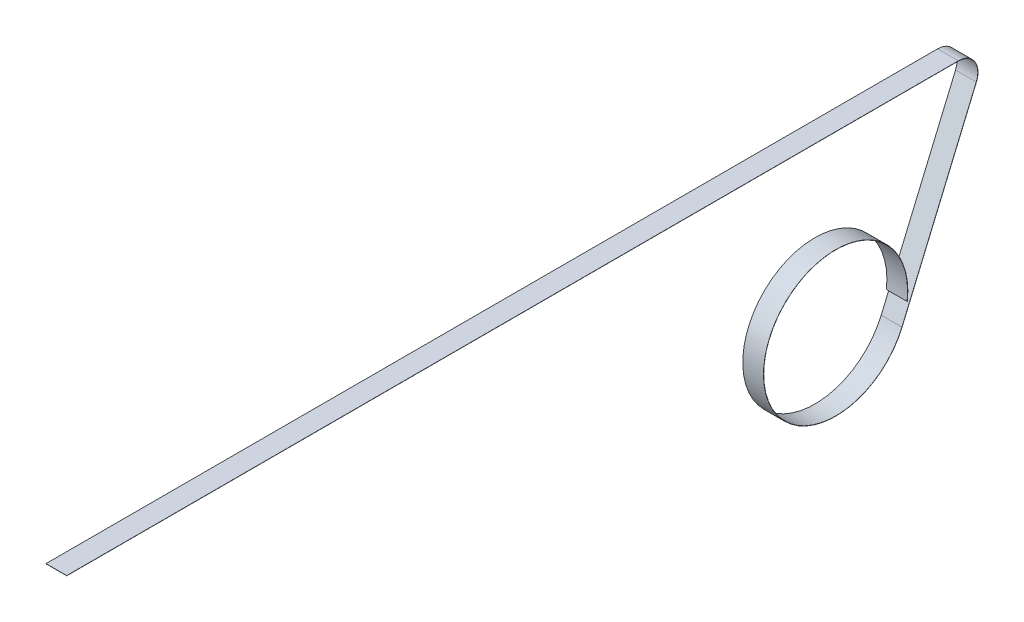
ISO-10303-21;
HEADER;
FILE_DESCRIPTION(('STEP AP214'),'2;1');
FILE_NAME('part.step','',(''),(''),'','','');
FILE_SCHEMA(('AUTOMOTIVE_DESIGN { 1 0 10303 214 1 1 1 1 }'));
ENDSEC;
DATA;
#1=APPLICATION_CONTEXT('core data for automotive mechanical design processes');
#2=APPLICATION_PROTOCOL_DEFINITION('international standard','automotive_design',2000,#1);
#3=PRODUCT_CONTEXT('',#1,'mechanical');
#4=PRODUCT('Part','Part','',(#3));
#5=PRODUCT_RELATED_PRODUCT_CATEGORY('part','',(#4));
#6=PRODUCT_DEFINITION_FORMATION('','',#4);
#7=PRODUCT_DEFINITION_CONTEXT('part definition',#1,'design');
#8=PRODUCT_DEFINITION('design','',#6,#7);
#9=PRODUCT_DEFINITION_SHAPE('','',#8);
#10=(LENGTH_UNIT() NAMED_UNIT(*) SI_UNIT(.MILLI.,.METRE.));
#11=(NAMED_UNIT(*) PLANE_ANGLE_UNIT() SI_UNIT($,.RADIAN.));
#12=(NAMED_UNIT(*) SI_UNIT($,.STERADIAN.) SOLID_ANGLE_UNIT());
#13=UNCERTAINTY_MEASURE_WITH_UNIT(LENGTH_MEASURE(1.E-05),#10,'distance_accuracy_value','');
#14=(GEOMETRIC_REPRESENTATION_CONTEXT(3) GLOBAL_UNCERTAINTY_ASSIGNED_CONTEXT((#13)) GLOBAL_UNIT_ASSIGNED_CONTEXT((#10,
#11,#12)) REPRESENTATION_CONTEXT('',''));
#15=CARTESIAN_POINT('',(0.,0.,0.));
#16=DIRECTION('',(0.,0.,1.));
#17=DIRECTION('',(1.,0.,0.));
#18=AXIS2_PLACEMENT_3D('',#15,#16,#17);
#19=CARTESIAN_POINT('',(0.,0.,1091.946));
#20=DIRECTION('',(-1.,0.,0.));
#21=DIRECTION('',(0.,0.,1.));
#22=AXIS2_PLACEMENT_3D('',#19,#20,#21);
#23=PLANE('',#22);
#24=DIRECTION('',(0.,0.,-1.));
#25=VECTOR('',#24,1.);
#26=CARTESIAN_POINT('',(0.,0.254,1091.946));
#27=LINE('',#26,#25);
#28=CARTESIAN_POINT('',(0.,0.254,1091.946));
#29=VERTEX_POINT('',#28);
#30=CARTESIAN_POINT('',(0.,0.254,0.));
#31=VERTEX_POINT('',#30);
#32=EDGE_CURVE('E36',#29,#31,#27,.T.);
#33=ORIENTED_EDGE('',*,*,#32,.T.);
#34=CARTESIAN_POINT('',(0.,-23.876,0.));
#35=DIRECTION('',(1.,0.,0.));
#36=DIRECTION('',(0.,0.,-1.));
#37=AXIS2_PLACEMENT_3D('',#34,#35,#36);
#38=CIRCLE('',#37,24.13);
#39=CARTESIAN_POINT('',(0.,-33.3037140253817,-22.2120487181084));
#40=VERTEX_POINT('',#39);
#41=EDGE_CURVE('E116',#40,#31,#38,.T.);
#42=ORIENTED_EDGE('',*,*,#41,.F.);
#43=DIRECTION('',(0.,0.920515902118044,-0.390705098441015));
#44=VECTOR('',#43,1.);
#45=CARTESIAN_POINT('',(0.,-33.3037140253817,-22.2120487181084));
#46=LINE('',#45,#44);
#47=CARTESIAN_POINT('',(0.,-247.777906394716,68.8196871268765));
#48=VERTEX_POINT('',#47);
#49=EDGE_CURVE('E141',#48,#40,#46,.T.);
#50=ORIENTED_EDGE('',*,*,#49,.F.);
#51=CARTESIAN_POINT('',(0.,-213.23905608288,150.194517093984));
#52=DIRECTION('',(1.,0.,0.));
#53=DIRECTION('',(0.,0.,-1.));
#54=AXIS2_PLACEMENT_3D('',#51,#52,#53);
#55=CIRCLE('',#54,88.401329928);
#56=CARTESIAN_POINT('',(0.,-223.70711093764,62.4151632538195));
#57=VERTEX_POINT('',#56);
#58=EDGE_CURVE('E138',#57,#48,#55,.T.);
#59=ORIENTED_EDGE('',*,*,#58,.F.);
#60=DIRECTION('',(0.,-0.302313418678431,-0.95320857994825));
#61=VECTOR('',#60,1.);
#62=CARTESIAN_POINT('',(0.,-223.628935638909,62.6616536868793));
#63=LINE('',#62,#61);
#64=CARTESIAN_POINT('',(0.,-223.628935638909,62.6616536868793));
#65=VERTEX_POINT('',#64);
#66=EDGE_CURVE('E135',#65,#57,#63,.T.);
#67=ORIENTED_EDGE('',*,*,#66,.F.);
#68=CARTESIAN_POINT('',(0.,-213.23905608288,150.194517093984));
#69=DIRECTION('',(-1.,0.,0.));
#70=DIRECTION('',(0.,0.,-1.));
#71=AXIS2_PLACEMENT_3D('',#68,#69,#70);
#72=CIRCLE('',#71,88.147329928);
#73=CARTESIAN_POINT('',(0.,-247.678667299712,69.0534981660145));
#74=VERTEX_POINT('',#73);
#75=EDGE_CURVE('E123',#74,#65,#72,.T.);
#76=ORIENTED_EDGE('',*,*,#75,.F.);
#77=DIRECTION('',(0.,-0.920515902118044,0.390705098441014));
#78=VECTOR('',#77,1.);
#79=CARTESIAN_POINT('',(0.,-33.2044749303777,-21.9782376789704));
#80=LINE('',#79,#78);
#81=CARTESIAN_POINT('',(0.,-33.2044749303777,-21.9782376789704));
#82=VERTEX_POINT('',#81);
#83=EDGE_CURVE('E109',#82,#74,#80,.T.);
#84=ORIENTED_EDGE('',*,*,#83,.F.);
#85=CARTESIAN_POINT('',(0.,-23.876,0.));
#86=DIRECTION('',(-1.,0.,0.));
#87=DIRECTION('',(0.,0.,-1.));
#88=AXIS2_PLACEMENT_3D('',#85,#86,#87);
#89=CIRCLE('',#88,23.876);
#90=CARTESIAN_POINT('',(0.,0.,0.));
#91=VERTEX_POINT('',#90);
#92=EDGE_CURVE('E120',#91,#82,#89,.T.);
#93=ORIENTED_EDGE('',*,*,#92,.F.);
#94=DIRECTION('',(0.,0.,-1.));
#95=VECTOR('',#94,1.);
#96=CARTESIAN_POINT('',(0.,0.,1091.946));
#97=LINE('',#96,#95);
#98=CARTESIAN_POINT('',(0.,0.,1091.946));
#99=VERTEX_POINT('',#98);
#100=EDGE_CURVE('E11',#99,#91,#97,.T.);
#101=ORIENTED_EDGE('',*,*,#100,.F.);
#102=DIRECTION('',(0.,1.,0.));
#103=VECTOR('',#102,1.);
#104=CARTESIAN_POINT('',(0.,0.,1091.946));
#105=LINE('',#104,#103);
#106=EDGE_CURVE('E169',#99,#29,#105,.T.);
#107=ORIENTED_EDGE('',*,*,#106,.T.);
#108=EDGE_LOOP('',(#33,#42,#50,#59,#67,#76,#84,#93,#101,#107));
#109=FACE_BOUND('',#108,.T.);
#110=ADVANCED_FACE('F33',(#109),#23,.T.);
#111=CARTESIAN_POINT('',(0.,0.,1091.946));
#112=DIRECTION('',(0.,1.,0.));
#113=DIRECTION('',(0.,0.,1.));
#114=AXIS2_PLACEMENT_3D('',#111,#112,#113);
#115=PLANE('',#114);
#116=DIRECTION('',(1.,0.,0.));
#117=VECTOR('',#116,1.);
#118=CARTESIAN_POINT('',(0.,0.,0.));
#119=LINE('',#118,#117);
#120=CARTESIAN_POINT('',(25.4,0.,0.));
#121=VERTEX_POINT('',#120);
#122=EDGE_CURVE('E127',#91,#121,#119,.T.);
#123=ORIENTED_EDGE('',*,*,#122,.T.);
#124=DIRECTION('',(0.,0.,-1.));
#125=VECTOR('',#124,1.);
#126=CARTESIAN_POINT('',(25.4,0.,1091.946));
#127=LINE('',#126,#125);
#128=CARTESIAN_POINT('',(25.4,0.,1091.946));
#129=VERTEX_POINT('',#128);
#130=EDGE_CURVE('E42',#129,#121,#127,.T.);
#131=ORIENTED_EDGE('',*,*,#130,.F.);
#132=DIRECTION('',(1.,0.,0.));
#133=VECTOR('',#132,1.);
#134=CARTESIAN_POINT('',(0.,0.,1091.946));
#135=LINE('',#134,#133);
#136=EDGE_CURVE('E176',#99,#129,#135,.T.);
#137=ORIENTED_EDGE('',*,*,#136,.F.);
#138=ORIENTED_EDGE('',*,*,#100,.T.);
#139=EDGE_LOOP('',(#123,#131,#137,#138));
#140=FACE_BOUND('',#139,.T.);
#141=ADVANCED_FACE('F213',(#140),#115,.F.);
#142=CARTESIAN_POINT('',(25.4,0.,1091.946));
#143=DIRECTION('',(-1.,0.,0.));
#144=DIRECTION('',(0.,0.,1.));
#145=AXIS2_PLACEMENT_3D('',#142,#143,#144);
#146=PLANE('',#145);
#147=ORIENTED_EDGE('',*,*,#130,.T.);
#148=CARTESIAN_POINT('',(25.4,-23.876,0.));
#149=DIRECTION('',(-1.,0.,0.));
#150=DIRECTION('',(0.,0.,-1.));
#151=AXIS2_PLACEMENT_3D('',#148,#149,#150);
#152=CIRCLE('',#151,23.876);
#153=CARTESIAN_POINT('',(25.4,-33.2044749303777,-21.9782376789704));
#154=VERTEX_POINT('',#153);
#155=EDGE_CURVE('E145',#121,#154,#152,.T.);
#156=ORIENTED_EDGE('',*,*,#155,.T.);
#157=DIRECTION('',(0.,-0.920515902118044,0.390705098441014));
#158=VECTOR('',#157,1.);
#159=CARTESIAN_POINT('',(25.4,-33.2044749303777,-21.9782376789704));
#160=LINE('',#159,#158);
#161=CARTESIAN_POINT('',(25.4,-247.678667299712,69.0534981660145));
#162=VERTEX_POINT('',#161);
#163=EDGE_CURVE('E111',#154,#162,#160,.T.);
#164=ORIENTED_EDGE('',*,*,#163,.T.);
#165=CARTESIAN_POINT('',(25.4,-213.23905608288,150.194517093984));
#166=DIRECTION('',(-1.,0.,0.));
#167=DIRECTION('',(0.,0.,-1.));
#168=AXIS2_PLACEMENT_3D('',#165,#166,#167);
#169=CIRCLE('',#168,88.147329928);
#170=CARTESIAN_POINT('',(25.4,-223.628935638909,62.6616536868793));
#171=VERTEX_POINT('',#170);
#172=EDGE_CURVE('E148',#162,#171,#169,.T.);
#173=ORIENTED_EDGE('',*,*,#172,.T.);
#174=DIRECTION('',(0.,-0.302313418678431,-0.95320857994825));
#175=VECTOR('',#174,1.);
#176=CARTESIAN_POINT('',(25.4,-223.628935638909,62.6616536868793));
#177=LINE('',#176,#175);
#178=CARTESIAN_POINT('',(25.4,-223.70711093764,62.4151632538195));
#179=VERTEX_POINT('',#178);
#180=EDGE_CURVE('E151',#171,#179,#177,.T.);
#181=ORIENTED_EDGE('',*,*,#180,.T.);
#182=CARTESIAN_POINT('',(25.4,-213.23905608288,150.194517093984));
#183=DIRECTION('',(1.,0.,0.));
#184=DIRECTION('',(0.,0.,-1.));
#185=AXIS2_PLACEMENT_3D('',#182,#183,#184);
#186=CIRCLE('',#185,88.401329928);
#187=CARTESIAN_POINT('',(25.4,-247.777906394716,68.8196871268765));
#188=VERTEX_POINT('',#187);
#189=EDGE_CURVE('E154',#179,#188,#186,.T.);
#190=ORIENTED_EDGE('',*,*,#189,.T.);
#191=DIRECTION('',(0.,0.920515902118044,-0.390705098441015));
#192=VECTOR('',#191,1.);
#193=CARTESIAN_POINT('',(25.4,-33.3037140253817,-22.2120487181084));
#194=LINE('',#193,#192);
#195=CARTESIAN_POINT('',(25.4,-33.3037140253817,-22.2120487181084));
#196=VERTEX_POINT('',#195);
#197=EDGE_CURVE('E131',#188,#196,#194,.T.);
#198=ORIENTED_EDGE('',*,*,#197,.T.);
#199=CARTESIAN_POINT('',(25.4,-23.876,0.));
#200=DIRECTION('',(1.,0.,0.));
#201=DIRECTION('',(0.,0.,-1.));
#202=AXIS2_PLACEMENT_3D('',#199,#200,#201);
#203=CIRCLE('',#202,24.13);
#204=CARTESIAN_POINT('',(25.4,0.254,0.));
#205=VERTEX_POINT('',#204);
#206=EDGE_CURVE('E128',#196,#205,#203,.T.);
#207=ORIENTED_EDGE('',*,*,#206,.T.);
#208=DIRECTION('',(0.,0.,-1.));
#209=VECTOR('',#208,1.);
#210=CARTESIAN_POINT('',(25.4,0.254,1091.946));
#211=LINE('',#210,#209);
#212=CARTESIAN_POINT('',(25.4,0.254,1091.946));
#213=VERTEX_POINT('',#212);
#214=EDGE_CURVE('E182',#213,#205,#211,.T.);
#215=ORIENTED_EDGE('',*,*,#214,.F.);
#216=DIRECTION('',(0.,1.,0.));
#217=VECTOR('',#216,1.);
#218=CARTESIAN_POINT('',(25.4,0.,1091.946));
#219=LINE('',#218,#217);
#220=EDGE_CURVE('E174',#129,#213,#219,.T.);
#221=ORIENTED_EDGE('',*,*,#220,.F.);
#222=EDGE_LOOP('',(#147,#156,#164,#173,#181,#190,#198,#207,#215,#221));
#223=FACE_BOUND('',#222,.T.);
#224=ADVANCED_FACE('F196',(#223),#146,.F.);
#225=CARTESIAN_POINT('',(0.,0.254,1091.946));
#226=DIRECTION('',(0.,1.,0.));
#227=DIRECTION('',(0.,0.,1.));
#228=AXIS2_PLACEMENT_3D('',#225,#226,#227);
#229=PLANE('',#228);
#230=DIRECTION('',(1.,0.,0.));
#231=VECTOR('',#230,1.);
#232=CARTESIAN_POINT('',(0.,0.254,0.));
#233=LINE('',#232,#231);
#234=EDGE_CURVE('E161',#31,#205,#233,.T.);
#235=ORIENTED_EDGE('',*,*,#234,.F.);
#236=ORIENTED_EDGE('',*,*,#32,.F.);
#237=DIRECTION('',(1.,0.,0.));
#238=VECTOR('',#237,1.);
#239=CARTESIAN_POINT('',(0.,0.254,1091.946));
#240=LINE('',#239,#238);
#241=EDGE_CURVE('E171',#29,#213,#240,.T.);
#242=ORIENTED_EDGE('',*,*,#241,.T.);
#243=ORIENTED_EDGE('',*,*,#214,.T.);
#244=EDGE_LOOP('',(#235,#236,#242,#243));
#245=FACE_BOUND('',#244,.T.);
#246=ADVANCED_FACE('F191',(#245),#229,.T.);
#247=CARTESIAN_POINT('',(0.,0.,1091.946));
#248=DIRECTION('',(0.,0.,-1.));
#249=DIRECTION('',(-1.,0.,0.));
#250=AXIS2_PLACEMENT_3D('',#247,#248,#249);
#251=PLANE('',#250);
#252=ORIENTED_EDGE('',*,*,#106,.F.);
#253=ORIENTED_EDGE('',*,*,#136,.T.);
#254=ORIENTED_EDGE('',*,*,#220,.T.);
#255=ORIENTED_EDGE('',*,*,#241,.F.);
#256=EDGE_LOOP('',(#252,#253,#254,#255));
#257=FACE_BOUND('',#256,.T.);
#258=ADVANCED_FACE('F215',(#257),#251,.F.);
#259=CARTESIAN_POINT('',(0.,-23.876,0.));
#260=DIRECTION('',(1.,0.,0.));
#261=DIRECTION('',(0.,0.,-1.));
#262=AXIS2_PLACEMENT_3D('',#259,#260,#261);
#263=CYLINDRICAL_SURFACE('',#262,23.876);
#264=ORIENTED_EDGE('',*,*,#155,.F.);
#265=ORIENTED_EDGE('',*,*,#122,.F.);
#266=ORIENTED_EDGE('',*,*,#92,.T.);
#267=DIRECTION('',(1.,0.,0.));
#268=VECTOR('',#267,1.);
#269=CARTESIAN_POINT('',(0.,-33.2044749303777,-21.9782376789704));
#270=LINE('',#269,#268);
#271=EDGE_CURVE('E106',#82,#154,#270,.T.);
#272=ORIENTED_EDGE('',*,*,#271,.T.);
#273=EDGE_LOOP('',(#264,#265,#266,#272));
#274=FACE_BOUND('',#273,.T.);
#275=ADVANCED_FACE('F125',(#274),#263,.F.);
#276=CARTESIAN_POINT('',(0.,-23.876,0.));
#277=DIRECTION('',(1.,0.,0.));
#278=DIRECTION('',(0.,0.,-1.));
#279=AXIS2_PLACEMENT_3D('',#276,#277,#278);
#280=CYLINDRICAL_SURFACE('',#279,24.13);
#281=ORIENTED_EDGE('',*,*,#206,.F.);
#282=DIRECTION('',(1.,0.,0.));
#283=VECTOR('',#282,1.);
#284=CARTESIAN_POINT('',(0.,-33.3037140253817,-22.2120487181084));
#285=LINE('',#284,#283);
#286=EDGE_CURVE('E159',#40,#196,#285,.T.);
#287=ORIENTED_EDGE('',*,*,#286,.F.);
#288=ORIENTED_EDGE('',*,*,#41,.T.);
#289=ORIENTED_EDGE('',*,*,#234,.T.);
#290=EDGE_LOOP('',(#281,#287,#288,#289));
#291=FACE_BOUND('',#290,.T.);
#292=ADVANCED_FACE('F194',(#291),#280,.T.);
#293=CARTESIAN_POINT('',(0.,-33.3037140253817,-22.2120487181084));
#294=DIRECTION('',(0.,-0.390705098441015,-0.920515902118044));
#295=DIRECTION('',(0.,0.920515902118044,-0.390705098441015));
#296=AXIS2_PLACEMENT_3D('',#293,#294,#295);
#297=PLANE('',#296);
#298=ORIENTED_EDGE('',*,*,#197,.F.);
#299=DIRECTION('',(1.,0.,0.));
#300=VECTOR('',#299,1.);
#301=CARTESIAN_POINT('',(0.,-247.777906394716,68.8196871268765));
#302=LINE('',#301,#300);
#303=EDGE_CURVE('E162',#48,#188,#302,.T.);
#304=ORIENTED_EDGE('',*,*,#303,.F.);
#305=ORIENTED_EDGE('',*,*,#49,.T.);
#306=ORIENTED_EDGE('',*,*,#286,.T.);
#307=EDGE_LOOP('',(#298,#304,#305,#306));
#308=FACE_BOUND('',#307,.T.);
#309=ADVANCED_FACE('F201',(#308),#297,.T.);
#310=CARTESIAN_POINT('',(0.,-213.23905608288,150.194517093984));
#311=DIRECTION('',(1.,0.,0.));
#312=DIRECTION('',(0.,0.,-1.));
#313=AXIS2_PLACEMENT_3D('',#310,#311,#312);
#314=CYLINDRICAL_SURFACE('',#313,88.401329928);
#315=ORIENTED_EDGE('',*,*,#189,.F.);
#316=DIRECTION('',(1.,0.,0.));
#317=VECTOR('',#316,1.);
#318=CARTESIAN_POINT('',(0.,-223.70711093764,62.4151632538195));
#319=LINE('',#318,#317);
#320=EDGE_CURVE('E164',#57,#179,#319,.T.);
#321=ORIENTED_EDGE('',*,*,#320,.F.);
#322=ORIENTED_EDGE('',*,*,#58,.T.);
#323=ORIENTED_EDGE('',*,*,#303,.T.);
#324=EDGE_LOOP('',(#315,#321,#322,#323));
#325=FACE_BOUND('',#324,.T.);
#326=ADVANCED_FACE('F204',(#325),#314,.T.);
#327=CARTESIAN_POINT('',(0.,-223.628935638909,62.6616536868793));
#328=DIRECTION('',(0.,-0.95320857994825,0.302313418678431));
#329=DIRECTION('',(0.,-0.302313418678431,-0.95320857994825));
#330=AXIS2_PLACEMENT_3D('',#327,#328,#329);
#331=PLANE('',#330);
#332=ORIENTED_EDGE('',*,*,#180,.F.);
#333=DIRECTION('',(1.,0.,0.));
#334=VECTOR('',#333,1.);
#335=CARTESIAN_POINT('',(0.,-223.628935638909,62.6616536868793));
#336=LINE('',#335,#334);
#337=EDGE_CURVE('E166',#65,#171,#336,.T.);
#338=ORIENTED_EDGE('',*,*,#337,.F.);
#339=ORIENTED_EDGE('',*,*,#66,.T.);
#340=ORIENTED_EDGE('',*,*,#320,.T.);
#341=EDGE_LOOP('',(#332,#338,#339,#340));
#342=FACE_BOUND('',#341,.T.);
#343=ADVANCED_FACE('F207',(#342),#331,.T.);
#344=CARTESIAN_POINT('',(0.,-213.23905608288,150.194517093984));
#345=DIRECTION('',(1.,0.,0.));
#346=DIRECTION('',(0.,0.,-1.));
#347=AXIS2_PLACEMENT_3D('',#344,#345,#346);
#348=CYLINDRICAL_SURFACE('',#347,88.147329928);
#349=ORIENTED_EDGE('',*,*,#172,.F.);
#350=DIRECTION('',(1.,0.,0.));
#351=VECTOR('',#350,1.);
#352=CARTESIAN_POINT('',(0.,-247.678667299712,69.0534981660145));
#353=LINE('',#352,#351);
#354=EDGE_CURVE('E115',#74,#162,#353,.T.);
#355=ORIENTED_EDGE('',*,*,#354,.F.);
#356=ORIENTED_EDGE('',*,*,#75,.T.);
#357=ORIENTED_EDGE('',*,*,#337,.T.);
#358=EDGE_LOOP('',(#349,#355,#356,#357));
#359=FACE_BOUND('',#358,.T.);
#360=ADVANCED_FACE('F210',(#359),#348,.F.);
#361=CARTESIAN_POINT('',(0.,-33.2044749303777,-21.9782376789704));
#362=DIRECTION('',(0.,0.390705098441014,0.920515902118044));
#363=DIRECTION('',(0.,-0.920515902118045,0.390705098441015));
#364=AXIS2_PLACEMENT_3D('',#361,#362,#363);
#365=PLANE('',#364);
#366=ORIENTED_EDGE('',*,*,#163,.F.);
#367=ORIENTED_EDGE('',*,*,#271,.F.);
#368=ORIENTED_EDGE('',*,*,#83,.T.);
#369=ORIENTED_EDGE('',*,*,#354,.T.);
#370=EDGE_LOOP('',(#366,#367,#368,#369));
#371=FACE_BOUND('',#370,.T.);
#372=ADVANCED_FACE('F108',(#371),#365,.T.);
#373=CLOSED_SHELL('',(#110,#141,#224,#246,#258,#275,#292,#309,#326,#343,#360,#372));
#374=MANIFOLD_SOLID_BREP('B2',#373);
#375=ADVANCED_BREP_SHAPE_REPRESENTATION('',(#18,#374),#14);
#376=SHAPE_DEFINITION_REPRESENTATION(#9,#375);
ENDSEC;
END-ISO-10303-21;
